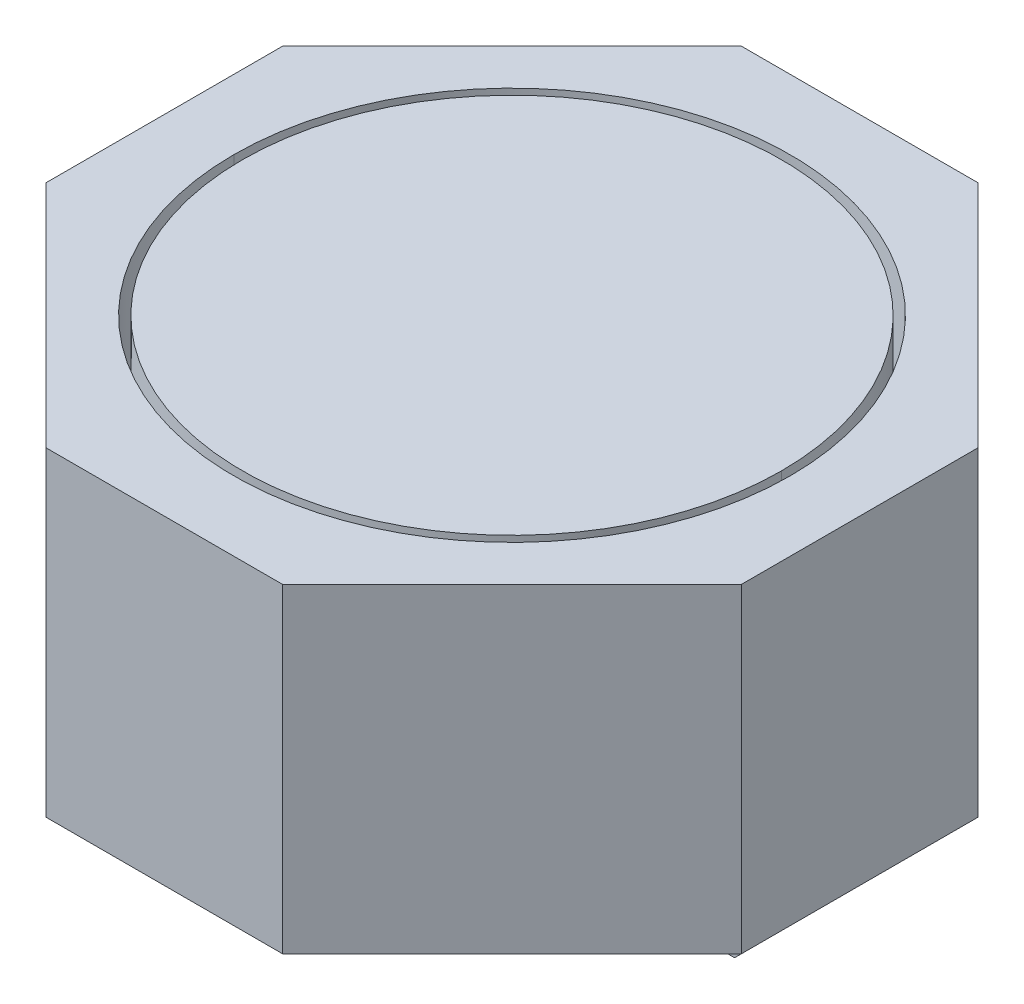
ISO-10303-21;
HEADER;
FILE_DESCRIPTION(('STEP AP214'),'2;1');
FILE_NAME('part.step','',(''),(''),'','','');
FILE_SCHEMA(('AUTOMOTIVE_DESIGN { 1 0 10303 214 1 1 1 1 }'));
ENDSEC;
DATA;
#1=APPLICATION_CONTEXT('core data for automotive mechanical design processes');
#2=APPLICATION_PROTOCOL_DEFINITION('international standard','automotive_design',2000,#1);
#3=PRODUCT_CONTEXT('',#1,'mechanical');
#4=PRODUCT('Part','Part','',(#3));
#5=PRODUCT_RELATED_PRODUCT_CATEGORY('part','',(#4));
#6=PRODUCT_DEFINITION_FORMATION('','',#4);
#7=PRODUCT_DEFINITION_CONTEXT('part definition',#1,'design');
#8=PRODUCT_DEFINITION('design','',#6,#7);
#9=PRODUCT_DEFINITION_SHAPE('','',#8);
#10=(LENGTH_UNIT() NAMED_UNIT(*) SI_UNIT(.MILLI.,.METRE.));
#11=(NAMED_UNIT(*) PLANE_ANGLE_UNIT() SI_UNIT($,.RADIAN.));
#12=(NAMED_UNIT(*) SI_UNIT($,.STERADIAN.) SOLID_ANGLE_UNIT());
#13=UNCERTAINTY_MEASURE_WITH_UNIT(LENGTH_MEASURE(1.E-05),#10,'distance_accuracy_value','');
#14=(GEOMETRIC_REPRESENTATION_CONTEXT(3) GLOBAL_UNCERTAINTY_ASSIGNED_CONTEXT((#13)) GLOBAL_UNIT_ASSIGNED_CONTEXT((#10,
#11,#12)) REPRESENTATION_CONTEXT('',''));
#15=CARTESIAN_POINT('',(0.,0.,0.));
#16=DIRECTION('',(0.,0.,1.));
#17=DIRECTION('',(1.,0.,0.));
#18=AXIS2_PLACEMENT_3D('',#15,#16,#17);
#19=CARTESIAN_POINT('',(0.,0.,0.));
#20=DIRECTION('',(0.,1.,0.));
#21=DIRECTION('',(1.,0.,0.));
#22=AXIS2_PLACEMENT_3D('',#19,#20,#21);
#23=CYLINDRICAL_SURFACE('',#22,4.);
#24=DIRECTION('',(0.,1.,0.));
#25=VECTOR('',#24,1.);
#26=CARTESIAN_POINT('',(4.,0.,0.));
#27=LINE('',#26,#25);
#28=CARTESIAN_POINT('',(4.,0.,0.));
#29=VERTEX_POINT('',#28);
#30=CARTESIAN_POINT('',(4.,4.6,0.));
#31=VERTEX_POINT('',#30);
#32=EDGE_CURVE('E422',#29,#31,#27,.T.);
#33=ORIENTED_EDGE('',*,*,#32,.T.);
#34=CARTESIAN_POINT('',(0.,4.6,0.));
#35=DIRECTION('',(0.,-1.,0.));
#36=DIRECTION('',(-1.,0.,0.));
#37=AXIS2_PLACEMENT_3D('',#34,#35,#36);
#38=CIRCLE('',#37,4.);
#39=CARTESIAN_POINT('',(-4.,4.6,0.));
#40=VERTEX_POINT('',#39);
#41=EDGE_CURVE('E432',#40,#31,#38,.T.);
#42=ORIENTED_EDGE('',*,*,#41,.F.);
#43=DIRECTION('',(0.,1.,0.));
#44=VECTOR('',#43,1.);
#45=CARTESIAN_POINT('',(-4.,0.,0.));
#46=LINE('',#45,#44);
#47=CARTESIAN_POINT('',(-4.,0.,0.));
#48=VERTEX_POINT('',#47);
#49=EDGE_CURVE('E447',#48,#40,#46,.T.);
#50=ORIENTED_EDGE('',*,*,#49,.F.);
#51=CARTESIAN_POINT('',(0.,0.,0.));
#52=DIRECTION('',(0.,1.,0.));
#53=DIRECTION('',(-0.925000000000094,0.,-0.379967103839038));
#54=AXIS2_PLACEMENT_3D('',#51,#52,#53);
#55=CIRCLE('',#54,4.);
#56=CARTESIAN_POINT('',(-3.7,0.,-1.519868415357));
#57=VERTEX_POINT('',#56);
#58=EDGE_CURVE('E254',#57,#48,#55,.T.);
#59=ORIENTED_EDGE('',*,*,#58,.F.);
#60=CARTESIAN_POINT('',(0.,0.,0.));
#61=DIRECTION('',(0.,-1.,0.));
#62=DIRECTION('',(-0.925000000000094,0.,-0.379967103839038));
#63=AXIS2_PLACEMENT_3D('',#60,#61,#62);
#64=CIRCLE('',#63,4.);
#65=CARTESIAN_POINT('',(3.7,0.,-1.519868415357));
#66=VERTEX_POINT('',#65);
#67=EDGE_CURVE('E344',#57,#66,#64,.T.);
#68=ORIENTED_EDGE('',*,*,#67,.T.);
#69=CARTESIAN_POINT('',(0.,0.,0.));
#70=DIRECTION('',(0.,1.,0.));
#71=DIRECTION('',(1.,0.,0.));
#72=AXIS2_PLACEMENT_3D('',#69,#70,#71);
#73=CIRCLE('',#72,4.);
#74=EDGE_CURVE('E466',#29,#66,#73,.T.);
#75=ORIENTED_EDGE('',*,*,#74,.F.);
#76=EDGE_LOOP('',(#33,#42,#50,#59,#68,#75));
#77=FACE_BOUND('',#76,.T.);
#78=ADVANCED_FACE('F17',(#77),#23,.F.);
#79=CARTESIAN_POINT('',(-5.,0.,1.6));
#80=DIRECTION('',(0.,0.,1.));
#81=DIRECTION('',(1.,0.,0.));
#82=AXIS2_PLACEMENT_3D('',#79,#80,#81);
#83=PLANE('',#82);
#84=DIRECTION('',(1.,0.,0.));
#85=VECTOR('',#84,1.);
#86=CARTESIAN_POINT('',(-4.8,-0.2,1.6));
#87=LINE('',#86,#85);
#88=CARTESIAN_POINT('',(-4.8,-0.2,1.6));
#89=VERTEX_POINT('',#88);
#90=CARTESIAN_POINT('',(-3.7,-0.2,1.6));
#91=VERTEX_POINT('',#90);
#92=EDGE_CURVE('E206',#89,#91,#87,.T.);
#93=ORIENTED_EDGE('',*,*,#92,.T.);
#94=DIRECTION('',(0.,-1.,0.));
#95=VECTOR('',#94,1.);
#96=CARTESIAN_POINT('',(-3.7,0.,1.6));
#97=LINE('',#96,#95);
#98=CARTESIAN_POINT('',(-3.7,0.,1.6));
#99=VERTEX_POINT('',#98);
#100=EDGE_CURVE('E337',#99,#91,#97,.T.);
#101=ORIENTED_EDGE('',*,*,#100,.F.);
#102=DIRECTION('',(1.,0.,0.));
#103=VECTOR('',#102,1.);
#104=CARTESIAN_POINT('',(-5.,0.,1.6));
#105=LINE('',#104,#103);
#106=CARTESIAN_POINT('',(-5.,0.,1.6));
#107=VERTEX_POINT('',#106);
#108=EDGE_CURVE('E195',#107,#99,#105,.T.);
#109=ORIENTED_EDGE('',*,*,#108,.F.);
#110=DIRECTION('',(0.707106781187048,-0.707106781186048,0.));
#111=VECTOR('',#110,1.);
#112=CARTESIAN_POINT('',(-5.,0.,1.6));
#113=LINE('',#112,#111);
#114=EDGE_CURVE('E38',#107,#89,#113,.T.);
#115=ORIENTED_EDGE('',*,*,#114,.T.);
#116=EDGE_LOOP('',(#93,#101,#109,#115));
#117=FACE_BOUND('',#116,.T.);
#118=ADVANCED_FACE('F384',(#117),#83,.T.);
#119=CARTESIAN_POINT('',(-5.,0.,1.7));
#120=DIRECTION('',(-0.707106781186548,0.,0.707106781186548));
#121=DIRECTION('',(0.,1.,0.));
#122=AXIS2_PLACEMENT_3D('',#119,#120,#121);
#123=PLANE('',#122);
#124=DIRECTION('',(0.,1.,0.));
#125=VECTOR('',#124,1.);
#126=CARTESIAN_POINT('',(-1.7,0.,5.));
#127=LINE('',#126,#125);
#128=CARTESIAN_POINT('',(-1.7,0.,5.));
#129=VERTEX_POINT('',#128);
#130=CARTESIAN_POINT('',(-1.7,4.6,5.));
#131=VERTEX_POINT('',#130);
#132=EDGE_CURVE('E11',#129,#131,#127,.T.);
#133=ORIENTED_EDGE('',*,*,#132,.T.);
#134=DIRECTION('',(0.707106781186548,0.,0.707106781186548));
#135=VECTOR('',#134,1.);
#136=CARTESIAN_POINT('',(-5.,4.6,1.7));
#137=LINE('',#136,#135);
#138=CARTESIAN_POINT('',(-5.,4.6,1.7));
#139=VERTEX_POINT('',#138);
#140=EDGE_CURVE('E520',#139,#131,#137,.T.);
#141=ORIENTED_EDGE('',*,*,#140,.F.);
#142=DIRECTION('',(0.,1.,0.));
#143=VECTOR('',#142,1.);
#144=CARTESIAN_POINT('',(-5.,0.,1.7));
#145=LINE('',#144,#143);
#146=CARTESIAN_POINT('',(-5.,0.,1.7));
#147=VERTEX_POINT('',#146);
#148=EDGE_CURVE('E329',#147,#139,#145,.T.);
#149=ORIENTED_EDGE('',*,*,#148,.F.);
#150=DIRECTION('',(0.707106781186548,0.,0.707106781186548));
#151=VECTOR('',#150,1.);
#152=CARTESIAN_POINT('',(-5.,0.,1.7));
#153=LINE('',#152,#151);
#154=EDGE_CURVE('E365',#147,#129,#153,.T.);
#155=ORIENTED_EDGE('',*,*,#154,.T.);
#156=EDGE_LOOP('',(#133,#141,#149,#155));
#157=FACE_BOUND('',#156,.T.);
#158=ADVANCED_FACE('F614',(#157),#123,.T.);
#159=CARTESIAN_POINT('',(-1.7,0.,5.));
#160=DIRECTION('',(0.,0.,1.));
#161=DIRECTION('',(1.,0.,0.));
#162=AXIS2_PLACEMENT_3D('',#159,#160,#161);
#163=PLANE('',#162);
#164=DIRECTION('',(0.,1.,0.));
#165=VECTOR('',#164,1.);
#166=CARTESIAN_POINT('',(1.7,0.,5.));
#167=LINE('',#166,#165);
#168=CARTESIAN_POINT('',(1.7,0.,5.));
#169=VERTEX_POINT('',#168);
#170=CARTESIAN_POINT('',(1.7,4.6,5.));
#171=VERTEX_POINT('',#170);
#172=EDGE_CURVE('E26',#169,#171,#167,.T.);
#173=ORIENTED_EDGE('',*,*,#172,.T.);
#174=DIRECTION('',(1.,0.,0.));
#175=VECTOR('',#174,1.);
#176=CARTESIAN_POINT('',(-1.7,4.6,5.));
#177=LINE('',#176,#175);
#178=EDGE_CURVE('E514',#131,#171,#177,.T.);
#179=ORIENTED_EDGE('',*,*,#178,.F.);
#180=ORIENTED_EDGE('',*,*,#132,.F.);
#181=DIRECTION('',(1.,0.,0.));
#182=VECTOR('',#181,1.);
#183=CARTESIAN_POINT('',(-1.7,0.,5.));
#184=LINE('',#183,#182);
#185=EDGE_CURVE('E364',#129,#169,#184,.T.);
#186=ORIENTED_EDGE('',*,*,#185,.T.);
#187=EDGE_LOOP('',(#173,#179,#180,#186));
#188=FACE_BOUND('',#187,.T.);
#189=ADVANCED_FACE('F541',(#188),#163,.T.);
#190=CARTESIAN_POINT('',(1.7,0.,5.));
#191=DIRECTION('',(0.707106781186548,0.,0.707106781186548));
#192=DIRECTION('',(0.,-1.,0.));
#193=AXIS2_PLACEMENT_3D('',#190,#191,#192);
#194=PLANE('',#193);
#195=DIRECTION('',(0.,1.,0.));
#196=VECTOR('',#195,1.);
#197=CARTESIAN_POINT('',(5.,0.,1.7));
#198=LINE('',#197,#196);
#199=CARTESIAN_POINT('',(5.,0.,1.7));
#200=VERTEX_POINT('',#199);
#201=CARTESIAN_POINT('',(5.,4.6,1.7));
#202=VERTEX_POINT('',#201);
#203=EDGE_CURVE('E227',#200,#202,#198,.T.);
#204=ORIENTED_EDGE('',*,*,#203,.T.);
#205=DIRECTION('',(0.707106781186548,0.,-0.707106781186548));
#206=VECTOR('',#205,1.);
#207=CARTESIAN_POINT('',(1.7,4.6,5.));
#208=LINE('',#207,#206);
#209=EDGE_CURVE('E499',#171,#202,#208,.T.);
#210=ORIENTED_EDGE('',*,*,#209,.F.);
#211=ORIENTED_EDGE('',*,*,#172,.F.);
#212=DIRECTION('',(0.707106781186548,0.,-0.707106781186548));
#213=VECTOR('',#212,1.);
#214=CARTESIAN_POINT('',(1.7,0.,5.));
#215=LINE('',#214,#213);
#216=EDGE_CURVE('E361',#169,#200,#215,.T.);
#217=ORIENTED_EDGE('',*,*,#216,.T.);
#218=EDGE_LOOP('',(#204,#210,#211,#217));
#219=FACE_BOUND('',#218,.T.);
#220=ADVANCED_FACE('F693',(#219),#194,.T.);
#221=CARTESIAN_POINT('',(5.,0.,1.7));
#222=DIRECTION('',(1.,0.,0.));
#223=DIRECTION('',(0.,1.,0.));
#224=AXIS2_PLACEMENT_3D('',#221,#222,#223);
#225=PLANE('',#224);
#226=DIRECTION('',(0.,0.,-1.));
#227=VECTOR('',#226,1.);
#228=CARTESIAN_POINT('',(5.,0.,-1.6));
#229=LINE('',#228,#227);
#230=CARTESIAN_POINT('',(5.,0.,-1.6));
#231=VERTEX_POINT('',#230);
#232=CARTESIAN_POINT('',(5.,0.,-1.7));
#233=VERTEX_POINT('',#232);
#234=EDGE_CURVE('E272',#231,#233,#229,.T.);
#235=ORIENTED_EDGE('',*,*,#234,.T.);
#236=DIRECTION('',(0.,1.,0.));
#237=VECTOR('',#236,1.);
#238=CARTESIAN_POINT('',(5.,0.,-1.7));
#239=LINE('',#238,#237);
#240=CARTESIAN_POINT('',(5.,4.6,-1.7));
#241=VERTEX_POINT('',#240);
#242=EDGE_CURVE('E224',#233,#241,#239,.T.);
#243=ORIENTED_EDGE('',*,*,#242,.T.);
#244=DIRECTION('',(0.,0.,-1.));
#245=VECTOR('',#244,1.);
#246=CARTESIAN_POINT('',(5.,4.6,1.7));
#247=LINE('',#246,#245);
#248=EDGE_CURVE('E495',#202,#241,#247,.T.);
#249=ORIENTED_EDGE('',*,*,#248,.F.);
#250=ORIENTED_EDGE('',*,*,#203,.F.);
#251=DIRECTION('',(0.,0.,-1.));
#252=VECTOR('',#251,1.);
#253=CARTESIAN_POINT('',(5.,0.,1.7));
#254=LINE('',#253,#252);
#255=CARTESIAN_POINT('',(5.,0.,1.6));
#256=VERTEX_POINT('',#255);
#257=EDGE_CURVE('E271',#200,#256,#254,.T.);
#258=ORIENTED_EDGE('',*,*,#257,.T.);
#259=DIRECTION('',(0.,0.,1.));
#260=VECTOR('',#259,1.);
#261=CARTESIAN_POINT('',(5.,0.,-1.6));
#262=LINE('',#261,#260);
#263=EDGE_CURVE('E174',#231,#256,#262,.T.);
#264=ORIENTED_EDGE('',*,*,#263,.F.);
#265=EDGE_LOOP('',(#235,#243,#249,#250,#258,#264));
#266=FACE_BOUND('',#265,.T.);
#267=ADVANCED_FACE('F701',(#266),#225,.T.);
#268=CARTESIAN_POINT('',(5.,0.,-1.7));
#269=DIRECTION('',(0.707106781186548,0.,-0.707106781186548));
#270=DIRECTION('',(0.,-1.,0.));
#271=AXIS2_PLACEMENT_3D('',#268,#269,#270);
#272=PLANE('',#271);
#273=DIRECTION('',(0.,1.,0.));
#274=VECTOR('',#273,1.);
#275=CARTESIAN_POINT('',(1.7,0.,-5.));
#276=LINE('',#275,#274);
#277=CARTESIAN_POINT('',(1.7,0.,-5.));
#278=VERTEX_POINT('',#277);
#279=CARTESIAN_POINT('',(1.7,4.6,-5.));
#280=VERTEX_POINT('',#279);
#281=EDGE_CURVE('E219',#278,#280,#276,.T.);
#282=ORIENTED_EDGE('',*,*,#281,.T.);
#283=DIRECTION('',(-0.707106781186548,0.,-0.707106781186548));
#284=VECTOR('',#283,1.);
#285=CARTESIAN_POINT('',(5.,4.6,-1.7));
#286=LINE('',#285,#284);
#287=EDGE_CURVE('E498',#241,#280,#286,.T.);
#288=ORIENTED_EDGE('',*,*,#287,.F.);
#289=ORIENTED_EDGE('',*,*,#242,.F.);
#290=DIRECTION('',(-0.707106781186548,0.,-0.707106781186548));
#291=VECTOR('',#290,1.);
#292=CARTESIAN_POINT('',(5.,0.,-1.7));
#293=LINE('',#292,#291);
#294=EDGE_CURVE('E353',#233,#278,#293,.T.);
#295=ORIENTED_EDGE('',*,*,#294,.T.);
#296=EDGE_LOOP('',(#282,#288,#289,#295));
#297=FACE_BOUND('',#296,.T.);
#298=ADVANCED_FACE('F709',(#297),#272,.T.);
#299=CARTESIAN_POINT('',(1.7,0.,-5.));
#300=DIRECTION('',(0.,0.,-1.));
#301=DIRECTION('',(0.,-1.,0.));
#302=AXIS2_PLACEMENT_3D('',#299,#300,#301);
#303=PLANE('',#302);
#304=DIRECTION('',(0.,1.,0.));
#305=VECTOR('',#304,1.);
#306=CARTESIAN_POINT('',(-1.7,0.,-5.));
#307=LINE('',#306,#305);
#308=CARTESIAN_POINT('',(-1.7,0.,-5.));
#309=VERTEX_POINT('',#308);
#310=CARTESIAN_POINT('',(-1.7,4.6,-5.));
#311=VERTEX_POINT('',#310);
#312=EDGE_CURVE('E215',#309,#311,#307,.T.);
#313=ORIENTED_EDGE('',*,*,#312,.T.);
#314=DIRECTION('',(-1.,0.,0.));
#315=VECTOR('',#314,1.);
#316=CARTESIAN_POINT('',(1.7,4.6,-5.));
#317=LINE('',#316,#315);
#318=EDGE_CURVE('E433',#280,#311,#317,.T.);
#319=ORIENTED_EDGE('',*,*,#318,.F.);
#320=ORIENTED_EDGE('',*,*,#281,.F.);
#321=DIRECTION('',(-1.,0.,0.));
#322=VECTOR('',#321,1.);
#323=CARTESIAN_POINT('',(1.7,0.,-5.));
#324=LINE('',#323,#322);
#325=EDGE_CURVE('E357',#278,#309,#324,.T.);
#326=ORIENTED_EDGE('',*,*,#325,.T.);
#327=EDGE_LOOP('',(#313,#319,#320,#326));
#328=FACE_BOUND('',#327,.T.);
#329=ADVANCED_FACE('F718',(#328),#303,.T.);
#330=CARTESIAN_POINT('',(-1.7,0.,-5.));
#331=DIRECTION('',(-0.707106781186548,0.,-0.707106781186548));
#332=DIRECTION('',(-0.707106781186548,0.,0.707106781186548));
#333=AXIS2_PLACEMENT_3D('',#330,#331,#332);
#334=PLANE('',#333);
#335=DIRECTION('',(0.,1.,0.));
#336=VECTOR('',#335,1.);
#337=CARTESIAN_POINT('',(-5.,0.,-1.7));
#338=LINE('',#337,#336);
#339=CARTESIAN_POINT('',(-5.,0.,-1.7));
#340=VERTEX_POINT('',#339);
#341=CARTESIAN_POINT('',(-5.,4.6,-1.7));
#342=VERTEX_POINT('',#341);
#343=EDGE_CURVE('E220',#340,#342,#338,.T.);
#344=ORIENTED_EDGE('',*,*,#343,.T.);
#345=DIRECTION('',(-0.707106781186548,0.,0.707106781186548));
#346=VECTOR('',#345,1.);
#347=CARTESIAN_POINT('',(-1.7,4.6,-5.));
#348=LINE('',#347,#346);
#349=EDGE_CURVE('E428',#311,#342,#348,.T.);
#350=ORIENTED_EDGE('',*,*,#349,.F.);
#351=ORIENTED_EDGE('',*,*,#312,.F.);
#352=DIRECTION('',(-0.707106781186548,0.,0.707106781186548));
#353=VECTOR('',#352,1.);
#354=CARTESIAN_POINT('',(-1.7,0.,-5.));
#355=LINE('',#354,#353);
#356=EDGE_CURVE('E352',#309,#340,#355,.T.);
#357=ORIENTED_EDGE('',*,*,#356,.T.);
#358=EDGE_LOOP('',(#344,#350,#351,#357));
#359=FACE_BOUND('',#358,.T.);
#360=ADVANCED_FACE('F727',(#359),#334,.T.);
#361=CARTESIAN_POINT('',(-5.,0.,-1.7));
#362=DIRECTION('',(-1.,0.,0.));
#363=DIRECTION('',(0.,0.,1.));
#364=AXIS2_PLACEMENT_3D('',#361,#362,#363);
#365=PLANE('',#364);
#366=DIRECTION('',(0.,0.,1.));
#367=VECTOR('',#366,1.);
#368=CARTESIAN_POINT('',(-5.,0.,1.6));
#369=LINE('',#368,#367);
#370=EDGE_CURVE('E368',#107,#147,#369,.T.);
#371=ORIENTED_EDGE('',*,*,#370,.T.);
#372=ORIENTED_EDGE('',*,*,#148,.T.);
#373=DIRECTION('',(0.,0.,1.));
#374=VECTOR('',#373,1.);
#375=CARTESIAN_POINT('',(-5.,4.6,-1.7));
#376=LINE('',#375,#374);
#377=EDGE_CURVE('E510',#342,#139,#376,.T.);
#378=ORIENTED_EDGE('',*,*,#377,.F.);
#379=ORIENTED_EDGE('',*,*,#343,.F.);
#380=DIRECTION('',(0.,0.,1.));
#381=VECTOR('',#380,1.);
#382=CARTESIAN_POINT('',(-5.,0.,-1.7));
#383=LINE('',#382,#381);
#384=CARTESIAN_POINT('',(-5.,0.,-1.6));
#385=VERTEX_POINT('',#384);
#386=EDGE_CURVE('E348',#340,#385,#383,.T.);
#387=ORIENTED_EDGE('',*,*,#386,.T.);
#388=DIRECTION('',(0.,0.,-1.));
#389=VECTOR('',#388,1.);
#390=CARTESIAN_POINT('',(-5.,0.,1.6));
#391=LINE('',#390,#389);
#392=EDGE_CURVE('E214',#107,#385,#391,.T.);
#393=ORIENTED_EDGE('',*,*,#392,.F.);
#394=EDGE_LOOP('',(#371,#372,#378,#379,#387,#393));
#395=FACE_BOUND('',#394,.T.);
#396=ADVANCED_FACE('F733',(#395),#365,.T.);
#397=CARTESIAN_POINT('',(-3.7,0.,-1.6));
#398=DIRECTION('',(0.,0.,-1.));
#399=DIRECTION('',(0.,-1.,0.));
#400=AXIS2_PLACEMENT_3D('',#397,#398,#399);
#401=PLANE('',#400);
#402=DIRECTION('',(1.,0.,0.));
#403=VECTOR('',#402,1.);
#404=CARTESIAN_POINT('',(-5.,0.,-1.6));
#405=LINE('',#404,#403);
#406=CARTESIAN_POINT('',(-3.7,0.,-1.6));
#407=VERTEX_POINT('',#406);
#408=EDGE_CURVE('E347',#385,#407,#405,.T.);
#409=ORIENTED_EDGE('',*,*,#408,.T.);
#410=DIRECTION('',(0.,-1.,0.));
#411=VECTOR('',#410,1.);
#412=CARTESIAN_POINT('',(-3.7,0.,-1.6));
#413=LINE('',#412,#411);
#414=CARTESIAN_POINT('',(-3.7,-0.2,-1.6));
#415=VERTEX_POINT('',#414);
#416=EDGE_CURVE('E305',#407,#415,#413,.T.);
#417=ORIENTED_EDGE('',*,*,#416,.T.);
#418=DIRECTION('',(-1.,0.,0.));
#419=VECTOR('',#418,1.);
#420=CARTESIAN_POINT('',(-3.7,-0.2,-1.6));
#421=LINE('',#420,#419);
#422=CARTESIAN_POINT('',(-4.8,-0.2,-1.6));
#423=VERTEX_POINT('',#422);
#424=EDGE_CURVE('E202',#415,#423,#421,.T.);
#425=ORIENTED_EDGE('',*,*,#424,.T.);
#426=DIRECTION('',(-0.707106781187048,0.707106781186048,0.));
#427=VECTOR('',#426,1.);
#428=CARTESIAN_POINT('',(-4.8,-0.2,-1.6));
#429=LINE('',#428,#427);
#430=EDGE_CURVE('E333',#423,#385,#429,.T.);
#431=ORIENTED_EDGE('',*,*,#430,.T.);
#432=EDGE_LOOP('',(#409,#417,#425,#431));
#433=FACE_BOUND('',#432,.T.);
#434=ADVANCED_FACE('F738',(#433),#401,.T.);
#435=CARTESIAN_POINT('',(-4.9,-0.1,0.));
#436=DIRECTION('',(-0.707106781186548,-0.707106781186548,0.));
#437=DIRECTION('',(-0.707106781186548,0.707106781186548,0.));
#438=AXIS2_PLACEMENT_3D('',#435,#436,#437);
#439=PLANE('',#438);
#440=DIRECTION('',(0.,0.,-1.));
#441=VECTOR('',#440,1.);
#442=CARTESIAN_POINT('',(-4.8,-0.2,1.6));
#443=LINE('',#442,#441);
#444=EDGE_CURVE('E208',#89,#423,#443,.T.);
#445=ORIENTED_EDGE('',*,*,#444,.F.);
#446=ORIENTED_EDGE('',*,*,#114,.F.);
#447=ORIENTED_EDGE('',*,*,#392,.T.);
#448=ORIENTED_EDGE('',*,*,#430,.F.);
#449=EDGE_LOOP('',(#445,#446,#447,#448));
#450=FACE_BOUND('',#449,.T.);
#451=ADVANCED_FACE('F746',(#450),#439,.T.);
#452=CARTESIAN_POINT('',(0.,-0.2,0.));
#453=DIRECTION('',(0.,1.,0.));
#454=DIRECTION('',(1.,0.,0.));
#455=AXIS2_PLACEMENT_3D('',#452,#453,#454);
#456=PLANE('',#455);
#457=ORIENTED_EDGE('',*,*,#424,.F.);
#458=DIRECTION('',(0.,0.,-1.));
#459=VECTOR('',#458,1.);
#460=CARTESIAN_POINT('',(-3.7,-0.2,1.6));
#461=LINE('',#460,#459);
#462=EDGE_CURVE('E310',#91,#415,#461,.T.);
#463=ORIENTED_EDGE('',*,*,#462,.F.);
#464=ORIENTED_EDGE('',*,*,#92,.F.);
#465=ORIENTED_EDGE('',*,*,#444,.T.);
#466=EDGE_LOOP('',(#457,#463,#464,#465));
#467=FACE_BOUND('',#466,.T.);
#468=ADVANCED_FACE('F762',(#467),#456,.F.);
#469=CARTESIAN_POINT('',(0.,-0.2,0.));
#470=DIRECTION('',(0.,1.,0.));
#471=DIRECTION('',(1.,0.,0.));
#472=AXIS2_PLACEMENT_3D('',#469,#470,#471);
#473=PLANE('',#472);
#474=DIRECTION('',(1.,0.,0.));
#475=VECTOR('',#474,1.);
#476=CARTESIAN_POINT('',(3.7,-0.2,1.6));
#477=LINE('',#476,#475);
#478=CARTESIAN_POINT('',(3.7,-0.2,1.6));
#479=VERTEX_POINT('',#478);
#480=CARTESIAN_POINT('',(4.8,-0.2,1.6));
#481=VERTEX_POINT('',#480);
#482=EDGE_CURVE('E207',#479,#481,#477,.T.);
#483=ORIENTED_EDGE('',*,*,#482,.F.);
#484=DIRECTION('',(0.,0.,1.));
#485=VECTOR('',#484,1.);
#486=CARTESIAN_POINT('',(3.7,-0.2,-1.6));
#487=LINE('',#486,#485);
#488=CARTESIAN_POINT('',(3.7,-0.2,-1.6));
#489=VERTEX_POINT('',#488);
#490=EDGE_CURVE('E187',#489,#479,#487,.T.);
#491=ORIENTED_EDGE('',*,*,#490,.F.);
#492=DIRECTION('',(-1.,0.,0.));
#493=VECTOR('',#492,1.);
#494=CARTESIAN_POINT('',(4.8,-0.2,-1.6));
#495=LINE('',#494,#493);
#496=CARTESIAN_POINT('',(4.8,-0.2,-1.6));
#497=VERTEX_POINT('',#496);
#498=EDGE_CURVE('E179',#497,#489,#495,.T.);
#499=ORIENTED_EDGE('',*,*,#498,.F.);
#500=DIRECTION('',(0.,0.,1.));
#501=VECTOR('',#500,1.);
#502=CARTESIAN_POINT('',(4.8,-0.2,-1.6));
#503=LINE('',#502,#501);
#504=EDGE_CURVE('E163',#497,#481,#503,.T.);
#505=ORIENTED_EDGE('',*,*,#504,.T.);
#506=EDGE_LOOP('',(#483,#491,#499,#505));
#507=FACE_BOUND('',#506,.T.);
#508=ADVANCED_FACE('F185',(#507),#473,.F.);
#509=CARTESIAN_POINT('',(3.7,0.,1.6));
#510=DIRECTION('',(0.,0.,1.));
#511=DIRECTION('',(1.,0.,0.));
#512=AXIS2_PLACEMENT_3D('',#509,#510,#511);
#513=PLANE('',#512);
#514=DIRECTION('',(-1.,0.,0.));
#515=VECTOR('',#514,1.);
#516=CARTESIAN_POINT('',(5.,0.,1.6));
#517=LINE('',#516,#515);
#518=CARTESIAN_POINT('',(3.7,0.,1.6));
#519=VERTEX_POINT('',#518);
#520=EDGE_CURVE('E190',#256,#519,#517,.T.);
#521=ORIENTED_EDGE('',*,*,#520,.T.);
#522=DIRECTION('',(0.,-1.,0.));
#523=VECTOR('',#522,1.);
#524=CARTESIAN_POINT('',(3.7,0.,1.6));
#525=LINE('',#524,#523);
#526=EDGE_CURVE('E313',#519,#479,#525,.T.);
#527=ORIENTED_EDGE('',*,*,#526,.T.);
#528=ORIENTED_EDGE('',*,*,#482,.T.);
#529=DIRECTION('',(0.707106781186548,0.707106781186548,0.));
#530=VECTOR('',#529,1.);
#531=CARTESIAN_POINT('',(4.8,-0.2,1.6));
#532=LINE('',#531,#530);
#533=EDGE_CURVE('E170',#481,#256,#532,.T.);
#534=ORIENTED_EDGE('',*,*,#533,.T.);
#535=EDGE_LOOP('',(#521,#527,#528,#534));
#536=FACE_BOUND('',#535,.T.);
#537=ADVANCED_FACE('F483',(#536),#513,.T.);
#538=CARTESIAN_POINT('',(4.9,-0.1,0.));
#539=DIRECTION('',(0.707106781186548,-0.707106781186548,0.));
#540=DIRECTION('',(0.,0.,-1.));
#541=AXIS2_PLACEMENT_3D('',#538,#539,#540);
#542=PLANE('',#541);
#543=ORIENTED_EDGE('',*,*,#504,.F.);
#544=DIRECTION('',(-0.707106781186548,-0.707106781186548,0.));
#545=VECTOR('',#544,1.);
#546=CARTESIAN_POINT('',(5.,0.,-1.6));
#547=LINE('',#546,#545);
#548=EDGE_CURVE('E167',#231,#497,#547,.T.);
#549=ORIENTED_EDGE('',*,*,#548,.F.);
#550=ORIENTED_EDGE('',*,*,#263,.T.);
#551=ORIENTED_EDGE('',*,*,#533,.F.);
#552=EDGE_LOOP('',(#543,#549,#550,#551));
#553=FACE_BOUND('',#552,.T.);
#554=ADVANCED_FACE('F165',(#553),#542,.T.);
#555=CARTESIAN_POINT('',(5.,0.,-1.6));
#556=DIRECTION('',(0.,0.,-1.));
#557=DIRECTION('',(0.,-1.,0.));
#558=AXIS2_PLACEMENT_3D('',#555,#556,#557);
#559=PLANE('',#558);
#560=ORIENTED_EDGE('',*,*,#498,.T.);
#561=DIRECTION('',(0.,-1.,0.));
#562=VECTOR('',#561,1.);
#563=CARTESIAN_POINT('',(3.7,0.,-1.6));
#564=LINE('',#563,#562);
#565=CARTESIAN_POINT('',(3.7,0.,-1.6));
#566=VERTEX_POINT('',#565);
#567=EDGE_CURVE('E304',#566,#489,#564,.T.);
#568=ORIENTED_EDGE('',*,*,#567,.F.);
#569=DIRECTION('',(-1.,0.,0.));
#570=VECTOR('',#569,1.);
#571=CARTESIAN_POINT('',(5.,0.,-1.6));
#572=LINE('',#571,#570);
#573=EDGE_CURVE('E181',#231,#566,#572,.T.);
#574=ORIENTED_EDGE('',*,*,#573,.F.);
#575=ORIENTED_EDGE('',*,*,#548,.T.);
#576=EDGE_LOOP('',(#560,#568,#574,#575));
#577=FACE_BOUND('',#576,.T.);
#578=ADVANCED_FACE('F177',(#577),#559,.T.);
#579=CARTESIAN_POINT('',(0.,0.,0.));
#580=DIRECTION('',(0.,1.,0.));
#581=DIRECTION('',(1.,0.,0.));
#582=AXIS2_PLACEMENT_3D('',#579,#580,#581);
#583=PLANE('',#582);
#584=ORIENTED_EDGE('',*,*,#257,.F.);
#585=ORIENTED_EDGE('',*,*,#216,.F.);
#586=ORIENTED_EDGE('',*,*,#185,.F.);
#587=ORIENTED_EDGE('',*,*,#154,.F.);
#588=ORIENTED_EDGE('',*,*,#370,.F.);
#589=ORIENTED_EDGE('',*,*,#108,.T.);
#590=DIRECTION('',(0.,0.,-1.));
#591=VECTOR('',#590,1.);
#592=CARTESIAN_POINT('',(-3.7,0.,1.6));
#593=LINE('',#592,#591);
#594=CARTESIAN_POINT('',(-3.7,0.,1.519868415357));
#595=VERTEX_POINT('',#594);
#596=EDGE_CURVE('E328',#99,#595,#593,.T.);
#597=ORIENTED_EDGE('',*,*,#596,.T.);
#598=CARTESIAN_POINT('',(0.,0.,0.));
#599=DIRECTION('',(0.,-1.,0.));
#600=DIRECTION('',(0.925000000000094,0.,0.379967103839038));
#601=AXIS2_PLACEMENT_3D('',#598,#599,#600);
#602=CIRCLE('',#601,4.);
#603=CARTESIAN_POINT('',(3.7,0.,1.519868415357));
#604=VERTEX_POINT('',#603);
#605=EDGE_CURVE('E409',#604,#595,#602,.T.);
#606=ORIENTED_EDGE('',*,*,#605,.F.);
#607=DIRECTION('',(0.,0.,1.));
#608=VECTOR('',#607,1.);
#609=CARTESIAN_POINT('',(3.7,0.,1.519868415357));
#610=LINE('',#609,#608);
#611=EDGE_CURVE('E317',#604,#519,#610,.T.);
#612=ORIENTED_EDGE('',*,*,#611,.T.);
#613=ORIENTED_EDGE('',*,*,#520,.F.);
#614=EDGE_LOOP('',(#584,#585,#586,#587,#588,#589,#597,#606,#612,#613));
#615=FACE_BOUND('',#614,.T.);
#616=ADVANCED_FACE('F379',(#615),#583,.F.);
#617=CARTESIAN_POINT('',(0.,0.,0.));
#618=DIRECTION('',(0.,1.,0.));
#619=DIRECTION('',(1.,0.,0.));
#620=AXIS2_PLACEMENT_3D('',#617,#618,#619);
#621=PLANE('',#620);
#622=DIRECTION('',(0.,0.,1.));
#623=VECTOR('',#622,1.);
#624=CARTESIAN_POINT('',(3.7,0.,-1.6));
#625=LINE('',#624,#623);
#626=EDGE_CURVE('E300',#566,#66,#625,.T.);
#627=ORIENTED_EDGE('',*,*,#626,.T.);
#628=ORIENTED_EDGE('',*,*,#67,.F.);
#629=DIRECTION('',(0.,0.,-1.));
#630=VECTOR('',#629,1.);
#631=CARTESIAN_POINT('',(-3.7,0.,-1.519868415357));
#632=LINE('',#631,#630);
#633=EDGE_CURVE('E309',#57,#407,#632,.T.);
#634=ORIENTED_EDGE('',*,*,#633,.T.);
#635=ORIENTED_EDGE('',*,*,#408,.F.);
#636=ORIENTED_EDGE('',*,*,#386,.F.);
#637=ORIENTED_EDGE('',*,*,#356,.F.);
#638=ORIENTED_EDGE('',*,*,#325,.F.);
#639=ORIENTED_EDGE('',*,*,#294,.F.);
#640=ORIENTED_EDGE('',*,*,#234,.F.);
#641=ORIENTED_EDGE('',*,*,#573,.T.);
#642=EDGE_LOOP('',(#627,#628,#634,#635,#636,#637,#638,#639,#640,#641));
#643=FACE_BOUND('',#642,.T.);
#644=ADVANCED_FACE('F605',(#643),#621,.F.);
#645=CARTESIAN_POINT('',(-3.7,0.,1.6));
#646=DIRECTION('',(1.,0.,0.));
#647=DIRECTION('',(0.,1.,0.));
#648=AXIS2_PLACEMENT_3D('',#645,#646,#647);
#649=PLANE('',#648);
#650=DIRECTION('',(0.,1.,0.));
#651=VECTOR('',#650,1.);
#652=CARTESIAN_POINT('',(-3.7,-0.1,1.151357893967));
#653=LINE('',#652,#651);
#654=CARTESIAN_POINT('',(-3.7,-0.1,1.151357893967));
#655=VERTEX_POINT('',#654);
#656=CARTESIAN_POINT('',(-3.7,0.,1.151357893967));
#657=VERTEX_POINT('',#656);
#658=EDGE_CURVE('E325',#655,#657,#653,.T.);
#659=ORIENTED_EDGE('',*,*,#658,.T.);
#660=DIRECTION('',(0.,0.,-1.));
#661=VECTOR('',#660,1.);
#662=CARTESIAN_POINT('',(-3.7,0.,1.519868415357));
#663=LINE('',#662,#661);
#664=EDGE_CURVE('E258',#595,#657,#663,.T.);
#665=ORIENTED_EDGE('',*,*,#664,.F.);
#666=ORIENTED_EDGE('',*,*,#596,.F.);
#667=ORIENTED_EDGE('',*,*,#100,.T.);
#668=ORIENTED_EDGE('',*,*,#462,.T.);
#669=ORIENTED_EDGE('',*,*,#416,.F.);
#670=ORIENTED_EDGE('',*,*,#633,.F.);
#671=DIRECTION('',(0.,0.,-1.));
#672=VECTOR('',#671,1.);
#673=CARTESIAN_POINT('',(-3.7,0.,-1.151357893967));
#674=LINE('',#673,#672);
#675=CARTESIAN_POINT('',(-3.7,0.,-1.151357893967));
#676=VERTEX_POINT('',#675);
#677=EDGE_CURVE('E251',#676,#57,#674,.T.);
#678=ORIENTED_EDGE('',*,*,#677,.F.);
#679=DIRECTION('',(0.,1.,1.176836406103E-13));
#680=VECTOR('',#679,1.);
#681=CARTESIAN_POINT('',(-3.7,-0.1,-1.151357893967));
#682=LINE('',#681,#680);
#683=CARTESIAN_POINT('',(-3.7,-0.1,-1.151357893967));
#684=VERTEX_POINT('',#683);
#685=EDGE_CURVE('E276',#684,#676,#682,.T.);
#686=ORIENTED_EDGE('',*,*,#685,.F.);
#687=DIRECTION('',(0.,0.,-1.));
#688=VECTOR('',#687,1.);
#689=CARTESIAN_POINT('',(-3.7,-0.1,1.151357893967));
#690=LINE('',#689,#688);
#691=EDGE_CURVE('E293',#655,#684,#690,.T.);
#692=ORIENTED_EDGE('',*,*,#691,.F.);
#693=EDGE_LOOP('',(#659,#665,#666,#667,#668,#669,#670,#678,#686,#692));
#694=FACE_BOUND('',#693,.T.);
#695=ADVANCED_FACE('F389',(#694),#649,.T.);
#696=CARTESIAN_POINT('',(0.,0.,0.));
#697=DIRECTION('',(0.,1.,0.));
#698=DIRECTION('',(1.,0.,0.));
#699=AXIS2_PLACEMENT_3D('',#696,#697,#698);
#700=CYLINDRICAL_SURFACE('',#699,3.875);
#701=DIRECTION('',(0.,1.,0.));
#702=VECTOR('',#701,1.);
#703=CARTESIAN_POINT('',(3.875,0.,0.));
#704=LINE('',#703,#702);
#705=CARTESIAN_POINT('',(3.875,0.,0.));
#706=VERTEX_POINT('',#705);
#707=CARTESIAN_POINT('',(3.875,4.6,0.));
#708=VERTEX_POINT('',#707);
#709=EDGE_CURVE('E280',#706,#708,#704,.T.);
#710=ORIENTED_EDGE('',*,*,#709,.T.);
#711=CARTESIAN_POINT('',(0.,4.6,0.));
#712=DIRECTION('',(0.,1.,0.));
#713=DIRECTION('',(-1.,0.,0.));
#714=AXIS2_PLACEMENT_3D('',#711,#712,#713);
#715=CIRCLE('',#714,3.875);
#716=CARTESIAN_POINT('',(-3.875,4.6,0.));
#717=VERTEX_POINT('',#716);
#718=EDGE_CURVE('E500',#717,#708,#715,.T.);
#719=ORIENTED_EDGE('',*,*,#718,.F.);
#720=DIRECTION('',(0.,1.,0.));
#721=VECTOR('',#720,1.);
#722=CARTESIAN_POINT('',(-3.875,0.,0.));
#723=LINE('',#722,#721);
#724=CARTESIAN_POINT('',(-3.875,0.,0.));
#725=VERTEX_POINT('',#724);
#726=EDGE_CURVE('E279',#725,#717,#723,.T.);
#727=ORIENTED_EDGE('',*,*,#726,.F.);
#728=CARTESIAN_POINT('',(0.,0.,0.));
#729=DIRECTION('',(0.,1.,0.));
#730=DIRECTION('',(-1.,0.,0.));
#731=AXIS2_PLACEMENT_3D('',#728,#729,#730);
#732=CIRCLE('',#731,3.875);
#733=EDGE_CURVE('E262',#725,#657,#732,.T.);
#734=ORIENTED_EDGE('',*,*,#733,.T.);
#735=ORIENTED_EDGE('',*,*,#658,.F.);
#736=CARTESIAN_POINT('',(0.,-0.1,0.));
#737=DIRECTION('',(0.,-1.,0.));
#738=DIRECTION('',(0.95483870967736,0.,0.297124617798112));
#739=AXIS2_PLACEMENT_3D('',#736,#737,#738);
#740=CIRCLE('',#739,3.875);
#741=CARTESIAN_POINT('',(3.7,-0.1,1.151357893967));
#742=VERTEX_POINT('',#741);
#743=EDGE_CURVE('E292',#742,#655,#740,.T.);
#744=ORIENTED_EDGE('',*,*,#743,.F.);
#745=DIRECTION('',(0.,1.,1.24344978758E-13));
#746=VECTOR('',#745,1.);
#747=CARTESIAN_POINT('',(3.7,-0.1,1.151357893967));
#748=LINE('',#747,#746);
#749=CARTESIAN_POINT('',(3.7,0.,1.151357893967));
#750=VERTEX_POINT('',#749);
#751=EDGE_CURVE('E321',#742,#750,#748,.T.);
#752=ORIENTED_EDGE('',*,*,#751,.T.);
#753=CARTESIAN_POINT('',(0.,0.,0.));
#754=DIRECTION('',(0.,1.,0.));
#755=DIRECTION('',(0.95483870967736,0.,0.297124617798112));
#756=AXIS2_PLACEMENT_3D('',#753,#754,#755);
#757=CIRCLE('',#756,3.875);
#758=EDGE_CURVE('E408',#750,#706,#757,.T.);
#759=ORIENTED_EDGE('',*,*,#758,.T.);
#760=EDGE_LOOP('',(#710,#719,#727,#734,#735,#744,#752,#759));
#761=FACE_BOUND('',#760,.T.);
#762=ADVANCED_FACE('F595',(#761),#700,.T.);
#763=CARTESIAN_POINT('',(3.7,0.,-1.6));
#764=DIRECTION('',(-1.,0.,0.));
#765=DIRECTION('',(0.,0.,1.));
#766=AXIS2_PLACEMENT_3D('',#763,#764,#765);
#767=PLANE('',#766);
#768=DIRECTION('',(0.,1.,0.));
#769=VECTOR('',#768,1.);
#770=CARTESIAN_POINT('',(3.7,-0.1,-1.151357893967));
#771=LINE('',#770,#769);
#772=CARTESIAN_POINT('',(3.7,-0.1,-1.151357893967));
#773=VERTEX_POINT('',#772);
#774=CARTESIAN_POINT('',(3.7,0.,-1.151357893967));
#775=VERTEX_POINT('',#774);
#776=EDGE_CURVE('E284',#773,#775,#771,.T.);
#777=ORIENTED_EDGE('',*,*,#776,.T.);
#778=DIRECTION('',(0.,0.,1.));
#779=VECTOR('',#778,1.);
#780=CARTESIAN_POINT('',(3.7,0.,-1.519868415357));
#781=LINE('',#780,#779);
#782=EDGE_CURVE('E474',#66,#775,#781,.T.);
#783=ORIENTED_EDGE('',*,*,#782,.F.);
#784=ORIENTED_EDGE('',*,*,#626,.F.);
#785=ORIENTED_EDGE('',*,*,#567,.T.);
#786=ORIENTED_EDGE('',*,*,#490,.T.);
#787=ORIENTED_EDGE('',*,*,#526,.F.);
#788=ORIENTED_EDGE('',*,*,#611,.F.);
#789=DIRECTION('',(0.,0.,1.));
#790=VECTOR('',#789,1.);
#791=CARTESIAN_POINT('',(3.7,0.,1.151357893967));
#792=LINE('',#791,#790);
#793=EDGE_CURVE('E463',#750,#604,#792,.T.);
#794=ORIENTED_EDGE('',*,*,#793,.F.);
#795=ORIENTED_EDGE('',*,*,#751,.F.);
#796=DIRECTION('',(0.,0.,1.));
#797=VECTOR('',#796,1.);
#798=CARTESIAN_POINT('',(3.7,-0.1,-1.151357893967));
#799=LINE('',#798,#797);
#800=EDGE_CURVE('E296',#773,#742,#799,.T.);
#801=ORIENTED_EDGE('',*,*,#800,.F.);
#802=EDGE_LOOP('',(#777,#783,#784,#785,#786,#787,#788,#794,#795,#801));
#803=FACE_BOUND('',#802,.T.);
#804=ADVANCED_FACE('F488',(#803),#767,.T.);
#805=CARTESIAN_POINT('',(0.,-0.1,0.));
#806=DIRECTION('',(0.,1.,0.));
#807=DIRECTION('',(1.,0.,0.));
#808=AXIS2_PLACEMENT_3D('',#805,#806,#807);
#809=PLANE('',#808);
#810=ORIENTED_EDGE('',*,*,#743,.T.);
#811=ORIENTED_EDGE('',*,*,#691,.T.);
#812=CARTESIAN_POINT('',(0.,-0.1,0.));
#813=DIRECTION('',(0.,-1.,0.));
#814=DIRECTION('',(-0.95483870967736,0.,-0.297124617798112));
#815=AXIS2_PLACEMENT_3D('',#812,#813,#814);
#816=CIRCLE('',#815,3.875);
#817=EDGE_CURVE('E288',#684,#773,#816,.T.);
#818=ORIENTED_EDGE('',*,*,#817,.T.);
#819=ORIENTED_EDGE('',*,*,#800,.T.);
#820=EDGE_LOOP('',(#810,#811,#818,#819));
#821=FACE_BOUND('',#820,.T.);
#822=ADVANCED_FACE('F603',(#821),#809,.F.);
#823=CARTESIAN_POINT('',(0.,0.,0.));
#824=DIRECTION('',(0.,1.,0.));
#825=DIRECTION('',(1.,0.,0.));
#826=AXIS2_PLACEMENT_3D('',#823,#824,#825);
#827=CYLINDRICAL_SURFACE('',#826,3.875);
#828=ORIENTED_EDGE('',*,*,#685,.T.);
#829=CARTESIAN_POINT('',(0.,0.,0.));
#830=DIRECTION('',(0.,1.,0.));
#831=DIRECTION('',(-0.95483870967736,0.,-0.297124617798112));
#832=AXIS2_PLACEMENT_3D('',#829,#830,#831);
#833=CIRCLE('',#832,3.875);
#834=EDGE_CURVE('E266',#676,#725,#833,.T.);
#835=ORIENTED_EDGE('',*,*,#834,.T.);
#836=ORIENTED_EDGE('',*,*,#726,.T.);
#837=CARTESIAN_POINT('',(0.,4.6,0.));
#838=DIRECTION('',(0.,1.,0.));
#839=DIRECTION('',(1.,0.,0.));
#840=AXIS2_PLACEMENT_3D('',#837,#838,#839);
#841=CIRCLE('',#840,3.875);
#842=EDGE_CURVE('E503',#708,#717,#841,.T.);
#843=ORIENTED_EDGE('',*,*,#842,.F.);
#844=ORIENTED_EDGE('',*,*,#709,.F.);
#845=CARTESIAN_POINT('',(0.,0.,0.));
#846=DIRECTION('',(0.,1.,0.));
#847=DIRECTION('',(1.,0.,0.));
#848=AXIS2_PLACEMENT_3D('',#845,#846,#847);
#849=CIRCLE('',#848,3.875);
#850=EDGE_CURVE('E249',#706,#775,#849,.T.);
#851=ORIENTED_EDGE('',*,*,#850,.T.);
#852=ORIENTED_EDGE('',*,*,#776,.F.);
#853=ORIENTED_EDGE('',*,*,#817,.F.);
#854=EDGE_LOOP('',(#828,#835,#836,#843,#844,#851,#852,#853));
#855=FACE_BOUND('',#854,.T.);
#856=ADVANCED_FACE('F587',(#855),#827,.T.);
#857=CARTESIAN_POINT('',(0.,0.,0.));
#858=DIRECTION('',(0.,1.,0.));
#859=DIRECTION('',(1.,0.,0.));
#860=AXIS2_PLACEMENT_3D('',#857,#858,#859);
#861=PLANE('',#860);
#862=ORIENTED_EDGE('',*,*,#677,.T.);
#863=ORIENTED_EDGE('',*,*,#58,.T.);
#864=CARTESIAN_POINT('',(0.,0.,0.));
#865=DIRECTION('',(0.,1.,0.));
#866=DIRECTION('',(-1.,0.,0.));
#867=AXIS2_PLACEMENT_3D('',#864,#865,#866);
#868=CIRCLE('',#867,4.);
#869=EDGE_CURVE('E399',#48,#595,#868,.T.);
#870=ORIENTED_EDGE('',*,*,#869,.T.);
#871=ORIENTED_EDGE('',*,*,#664,.T.);
#872=ORIENTED_EDGE('',*,*,#733,.F.);
#873=ORIENTED_EDGE('',*,*,#834,.F.);
#874=EDGE_LOOP('',(#862,#863,#870,#871,#872,#873));
#875=FACE_BOUND('',#874,.T.);
#876=ADVANCED_FACE('F401',(#875),#861,.T.);
#877=CARTESIAN_POINT('',(0.,0.,0.));
#878=DIRECTION('',(0.,1.,0.));
#879=DIRECTION('',(1.,0.,0.));
#880=AXIS2_PLACEMENT_3D('',#877,#878,#879);
#881=PLANE('',#880);
#882=ORIENTED_EDGE('',*,*,#758,.F.);
#883=ORIENTED_EDGE('',*,*,#793,.T.);
#884=CARTESIAN_POINT('',(0.,0.,0.));
#885=DIRECTION('',(0.,1.,0.));
#886=DIRECTION('',(0.925000000000094,0.,0.379967103839038));
#887=AXIS2_PLACEMENT_3D('',#884,#885,#886);
#888=CIRCLE('',#887,4.);
#889=EDGE_CURVE('E415',#604,#29,#888,.T.);
#890=ORIENTED_EDGE('',*,*,#889,.T.);
#891=ORIENTED_EDGE('',*,*,#74,.T.);
#892=ORIENTED_EDGE('',*,*,#782,.T.);
#893=ORIENTED_EDGE('',*,*,#850,.F.);
#894=EDGE_LOOP('',(#882,#883,#890,#891,#892,#893));
#895=FACE_BOUND('',#894,.T.);
#896=ADVANCED_FACE('F593',(#895),#881,.T.);
#897=CARTESIAN_POINT('',(0.,0.,0.));
#898=DIRECTION('',(0.,1.,0.));
#899=DIRECTION('',(1.,0.,0.));
#900=AXIS2_PLACEMENT_3D('',#897,#898,#899);
#901=CYLINDRICAL_SURFACE('',#900,4.);
#902=ORIENTED_EDGE('',*,*,#49,.T.);
#903=CARTESIAN_POINT('',(0.,4.6,0.));
#904=DIRECTION('',(0.,-1.,0.));
#905=DIRECTION('',(1.,0.,0.));
#906=AXIS2_PLACEMENT_3D('',#903,#904,#905);
#907=CIRCLE('',#906,4.);
#908=EDGE_CURVE('E443',#31,#40,#907,.T.);
#909=ORIENTED_EDGE('',*,*,#908,.F.);
#910=ORIENTED_EDGE('',*,*,#32,.F.);
#911=ORIENTED_EDGE('',*,*,#889,.F.);
#912=ORIENTED_EDGE('',*,*,#605,.T.);
#913=ORIENTED_EDGE('',*,*,#869,.F.);
#914=EDGE_LOOP('',(#902,#909,#910,#911,#912,#913));
#915=FACE_BOUND('',#914,.T.);
#916=ADVANCED_FACE('F412',(#915),#901,.F.);
#917=CARTESIAN_POINT('',(0.,4.6,0.));
#918=DIRECTION('',(0.,1.,0.));
#919=DIRECTION('',(1.,0.,0.));
#920=AXIS2_PLACEMENT_3D('',#917,#918,#919);
#921=PLANE('',#920);
#922=ORIENTED_EDGE('',*,*,#41,.T.);
#923=ORIENTED_EDGE('',*,*,#908,.T.);
#924=EDGE_LOOP('',(#922,#923));
#925=FACE_BOUND('',#924,.T.);
#926=ORIENTED_EDGE('',*,*,#377,.T.);
#927=ORIENTED_EDGE('',*,*,#140,.T.);
#928=ORIENTED_EDGE('',*,*,#178,.T.);
#929=ORIENTED_EDGE('',*,*,#209,.T.);
#930=ORIENTED_EDGE('',*,*,#248,.T.);
#931=ORIENTED_EDGE('',*,*,#287,.T.);
#932=ORIENTED_EDGE('',*,*,#318,.T.);
#933=ORIENTED_EDGE('',*,*,#349,.T.);
#934=EDGE_LOOP('',(#926,#927,#928,#929,#930,#931,#932,#933));
#935=FACE_BOUND('',#934,.T.);
#936=ADVANCED_FACE('F536',(#925,#935),#921,.T.);
#937=CARTESIAN_POINT('',(0.,4.6,0.));
#938=DIRECTION('',(0.,1.,0.));
#939=DIRECTION('',(1.,0.,0.));
#940=AXIS2_PLACEMENT_3D('',#937,#938,#939);
#941=PLANE('',#940);
#942=ORIENTED_EDGE('',*,*,#718,.T.);
#943=ORIENTED_EDGE('',*,*,#842,.T.);
#944=EDGE_LOOP('',(#942,#943));
#945=FACE_BOUND('',#944,.T.);
#946=ADVANCED_FACE('F619',(#945),#941,.T.);
#947=CLOSED_SHELL('',(#78,#118,#158,#189,#220,#267,#298,#329,#360,#396,#434,#451,#468,#508,#537,
#554,#578,#616,#644,#695,#762,#804,#822,#856,#876,#896,#916,#936,#946));
#948=MANIFOLD_SOLID_BREP('B1',#947);
#949=ADVANCED_BREP_SHAPE_REPRESENTATION('',(#18,#948),#14);
#950=SHAPE_DEFINITION_REPRESENTATION(#9,#949);
ENDSEC;
END-ISO-10303-21;
